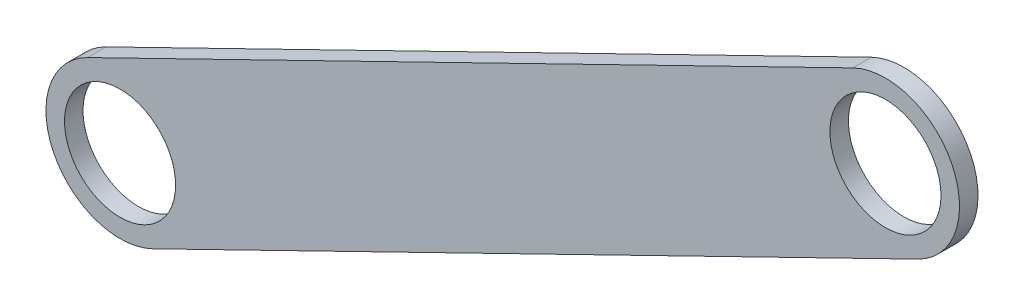
ISO-10303-21;
HEADER;
FILE_DESCRIPTION(('STEP AP214'),'2;1');
FILE_NAME('part.step','',(''),(''),'','','');
FILE_SCHEMA(('AUTOMOTIVE_DESIGN { 1 0 10303 214 1 1 1 1 }'));
ENDSEC;
DATA;
#1=APPLICATION_CONTEXT('core data for automotive mechanical design processes');
#2=APPLICATION_PROTOCOL_DEFINITION('international standard','automotive_design',2000,#1);
#3=PRODUCT_CONTEXT('',#1,'mechanical');
#4=PRODUCT('Part','Part','',(#3));
#5=PRODUCT_RELATED_PRODUCT_CATEGORY('part','',(#4));
#6=PRODUCT_DEFINITION_FORMATION('','',#4);
#7=PRODUCT_DEFINITION_CONTEXT('part definition',#1,'design');
#8=PRODUCT_DEFINITION('design','',#6,#7);
#9=PRODUCT_DEFINITION_SHAPE('','',#8);
#10=(LENGTH_UNIT() NAMED_UNIT(*) SI_UNIT(.MILLI.,.METRE.));
#11=(NAMED_UNIT(*) PLANE_ANGLE_UNIT() SI_UNIT($,.RADIAN.));
#12=(NAMED_UNIT(*) SI_UNIT($,.STERADIAN.) SOLID_ANGLE_UNIT());
#13=UNCERTAINTY_MEASURE_WITH_UNIT(LENGTH_MEASURE(1.E-05),#10,'distance_accuracy_value','');
#14=(GEOMETRIC_REPRESENTATION_CONTEXT(3) GLOBAL_UNCERTAINTY_ASSIGNED_CONTEXT((#13)) GLOBAL_UNIT_ASSIGNED_CONTEXT((#10,
#11,#12)) REPRESENTATION_CONTEXT('',''));
#15=CARTESIAN_POINT('',(0.,0.,0.));
#16=DIRECTION('',(0.,0.,1.));
#17=DIRECTION('',(1.,0.,0.));
#18=AXIS2_PLACEMENT_3D('',#15,#16,#17);
#19=CARTESIAN_POINT('',(0.,-12.,1.));
#20=DIRECTION('',(0.,0.,1.));
#21=DIRECTION('',(1.,0.,0.));
#22=AXIS2_PLACEMENT_3D('',#19,#20,#21);
#23=PLANE('',#22);
#24=CARTESIAN_POINT('',(0.,-12.,1.));
#25=DIRECTION('',(0.,0.,1.));
#26=DIRECTION('',(1.,0.,0.));
#27=AXIS2_PLACEMENT_3D('',#24,#25,#26);
#28=CIRCLE('',#27,3.);
#29=CARTESIAN_POINT('',(3.,-12.,1.));
#30=VERTEX_POINT('',#29);
#31=EDGE_CURVE('E108',#30,#30,#28,.T.);
#32=ORIENTED_EDGE('',*,*,#31,.F.);
#33=EDGE_LOOP('',(#32));
#34=FACE_BOUND('',#33,.T.);
#35=CARTESIAN_POINT('',(0.,-12.,1.));
#36=DIRECTION('',(0.,0.,1.));
#37=DIRECTION('',(1.,0.,0.));
#38=AXIS2_PLACEMENT_3D('',#35,#36,#37);
#39=CIRCLE('',#38,3.99999999999999);
#40=CARTESIAN_POINT('',(1.75511901397909,-15.5943785619727,1.));
#41=VERTEX_POINT('',#40);
#42=CARTESIAN_POINT('',(-1.75511901397908,-8.40562143802729,1.));
#43=VERTEX_POINT('',#42);
#44=EDGE_CURVE('E93',#41,#43,#39,.T.);
#45=ORIENTED_EDGE('',*,*,#44,.T.);
#46=DIRECTION('',(-0.89859464049318,-0.438779753494772,0.));
#47=VECTOR('',#46,1.);
#48=CARTESIAN_POINT('',(-1.75511901397908,-8.40562143802729,1.));
#49=LINE('',#48,#47);
#50=CARTESIAN_POINT('',(-43.0904724766654,-28.5894900987868,1.));
#51=VERTEX_POINT('',#50);
#52=EDGE_CURVE('E88',#43,#51,#49,.T.);
#53=ORIENTED_EDGE('',*,*,#52,.T.);
#54=CARTESIAN_POINT('',(-41.3353534626863,-32.1838686607595,1.));
#55=DIRECTION('',(0.,0.,1.));
#56=DIRECTION('',(1.,0.,0.));
#57=AXIS2_PLACEMENT_3D('',#54,#55,#56);
#58=CIRCLE('',#57,4.);
#59=CARTESIAN_POINT('',(-39.5802344487072,-35.7782472227322,1.));
#60=VERTEX_POINT('',#59);
#61=EDGE_CURVE('E91',#51,#60,#58,.T.);
#62=ORIENTED_EDGE('',*,*,#61,.T.);
#63=DIRECTION('',(0.89859464049318,0.438779753494772,0.));
#64=VECTOR('',#63,1.);
#65=CARTESIAN_POINT('',(1.75511901397909,-15.5943785619727,1.));
#66=LINE('',#65,#64);
#67=EDGE_CURVE('E58',#60,#41,#66,.T.);
#68=ORIENTED_EDGE('',*,*,#67,.T.);
#69=EDGE_LOOP('',(#45,#53,#62,#68));
#70=FACE_BOUND('',#69,.T.);
#71=CARTESIAN_POINT('',(-41.3353534626863,-32.1838686607595,1.));
#72=DIRECTION('',(0.,0.,1.));
#73=DIRECTION('',(1.,0.,0.));
#74=AXIS2_PLACEMENT_3D('',#71,#72,#73);
#75=CIRCLE('',#74,3.);
#76=CARTESIAN_POINT('',(-38.3353534626863,-32.1838686607595,1.));
#77=VERTEX_POINT('',#76);
#78=EDGE_CURVE('E123',#77,#77,#75,.T.);
#79=ORIENTED_EDGE('',*,*,#78,.F.);
#80=EDGE_LOOP('',(#79));
#81=FACE_BOUND('',#80,.T.);
#82=ADVANCED_FACE('F41',(#34,#70,#81),#23,.T.);
#83=CARTESIAN_POINT('',(0.,-12.,0.));
#84=DIRECTION('',(0.,0.,1.));
#85=DIRECTION('',(1.,0.,0.));
#86=AXIS2_PLACEMENT_3D('',#83,#84,#85);
#87=PLANE('',#86);
#88=CARTESIAN_POINT('',(0.,-12.,0.));
#89=DIRECTION('',(0.,0.,1.));
#90=DIRECTION('',(1.,0.,0.));
#91=AXIS2_PLACEMENT_3D('',#88,#89,#90);
#92=CIRCLE('',#91,3.99999999999999);
#93=CARTESIAN_POINT('',(1.75511901397909,-15.5943785619727,0.));
#94=VERTEX_POINT('',#93);
#95=CARTESIAN_POINT('',(-1.75511901397908,-8.40562143802729,0.));
#96=VERTEX_POINT('',#95);
#97=EDGE_CURVE('E105',#94,#96,#92,.T.);
#98=ORIENTED_EDGE('',*,*,#97,.F.);
#99=DIRECTION('',(0.89859464049318,0.438779753494772,0.));
#100=VECTOR('',#99,1.);
#101=CARTESIAN_POINT('',(1.75511901397909,-15.5943785619727,0.));
#102=LINE('',#101,#100);
#103=CARTESIAN_POINT('',(-39.5802344487072,-35.7782472227322,0.));
#104=VERTEX_POINT('',#103);
#105=EDGE_CURVE('E81',#104,#94,#102,.T.);
#106=ORIENTED_EDGE('',*,*,#105,.F.);
#107=CARTESIAN_POINT('',(-41.3353534626863,-32.1838686607595,0.));
#108=DIRECTION('',(0.,0.,1.));
#109=DIRECTION('',(1.,0.,0.));
#110=AXIS2_PLACEMENT_3D('',#107,#108,#109);
#111=CIRCLE('',#110,4.);
#112=CARTESIAN_POINT('',(-43.0904724766654,-28.5894900987868,0.));
#113=VERTEX_POINT('',#112);
#114=EDGE_CURVE('E75',#113,#104,#111,.T.);
#115=ORIENTED_EDGE('',*,*,#114,.F.);
#116=DIRECTION('',(-0.89859464049318,-0.438779753494772,0.));
#117=VECTOR('',#116,1.);
#118=CARTESIAN_POINT('',(-1.75511901397908,-8.40562143802729,0.));
#119=LINE('',#118,#117);
#120=EDGE_CURVE('E97',#96,#113,#119,.T.);
#121=ORIENTED_EDGE('',*,*,#120,.F.);
#122=EDGE_LOOP('',(#98,#106,#115,#121));
#123=FACE_BOUND('',#122,.T.);
#124=CARTESIAN_POINT('',(0.,-12.,0.));
#125=DIRECTION('',(0.,0.,1.));
#126=DIRECTION('',(1.,0.,0.));
#127=AXIS2_PLACEMENT_3D('',#124,#125,#126);
#128=CIRCLE('',#127,3.);
#129=CARTESIAN_POINT('',(3.,-12.,0.));
#130=VERTEX_POINT('',#129);
#131=EDGE_CURVE('E120',#130,#130,#128,.T.);
#132=ORIENTED_EDGE('',*,*,#131,.T.);
#133=EDGE_LOOP('',(#132));
#134=FACE_BOUND('',#133,.T.);
#135=CARTESIAN_POINT('',(-41.3353534626863,-32.1838686607595,0.));
#136=DIRECTION('',(0.,0.,1.));
#137=DIRECTION('',(1.,0.,0.));
#138=AXIS2_PLACEMENT_3D('',#135,#136,#137);
#139=CIRCLE('',#138,3.);
#140=CARTESIAN_POINT('',(-38.3353534626863,-32.1838686607595,0.));
#141=VERTEX_POINT('',#140);
#142=EDGE_CURVE('E126',#141,#141,#139,.T.);
#143=ORIENTED_EDGE('',*,*,#142,.T.);
#144=EDGE_LOOP('',(#143));
#145=FACE_BOUND('',#144,.T.);
#146=ADVANCED_FACE('F116',(#123,#134,#145),#87,.F.);
#147=CARTESIAN_POINT('',(0.,-12.,1.));
#148=DIRECTION('',(0.,0.,-1.));
#149=DIRECTION('',(-1.,0.,0.));
#150=AXIS2_PLACEMENT_3D('',#147,#148,#149);
#151=CYLINDRICAL_SURFACE('',#150,3.99999999999999);
#152=ORIENTED_EDGE('',*,*,#97,.T.);
#153=DIRECTION('',(0.,0.,-1.));
#154=VECTOR('',#153,1.);
#155=CARTESIAN_POINT('',(-1.75511901397908,-8.40562143802729,1.));
#156=LINE('',#155,#154);
#157=EDGE_CURVE('E11',#43,#96,#156,.T.);
#158=ORIENTED_EDGE('',*,*,#157,.F.);
#159=ORIENTED_EDGE('',*,*,#44,.F.);
#160=DIRECTION('',(0.,0.,-1.));
#161=VECTOR('',#160,1.);
#162=CARTESIAN_POINT('',(1.75511901397909,-15.5943785619727,1.));
#163=LINE('',#162,#161);
#164=EDGE_CURVE('E101',#41,#94,#163,.T.);
#165=ORIENTED_EDGE('',*,*,#164,.T.);
#166=EDGE_LOOP('',(#152,#158,#159,#165));
#167=FACE_BOUND('',#166,.T.);
#168=ADVANCED_FACE('F43',(#167),#151,.T.);
#169=CARTESIAN_POINT('',(-1.75511901397908,-8.40562143802729,1.));
#170=DIRECTION('',(0.438779753494772,-0.89859464049318,0.));
#171=DIRECTION('',(0.89859464049318,0.438779753494772,0.));
#172=AXIS2_PLACEMENT_3D('',#169,#170,#171);
#173=PLANE('',#172);
#174=ORIENTED_EDGE('',*,*,#120,.T.);
#175=DIRECTION('',(0.,0.,-1.));
#176=VECTOR('',#175,1.);
#177=CARTESIAN_POINT('',(-43.0904724766654,-28.5894900987868,1.));
#178=LINE('',#177,#176);
#179=EDGE_CURVE('E50',#51,#113,#178,.T.);
#180=ORIENTED_EDGE('',*,*,#179,.F.);
#181=ORIENTED_EDGE('',*,*,#52,.F.);
#182=ORIENTED_EDGE('',*,*,#157,.T.);
#183=EDGE_LOOP('',(#174,#180,#181,#182));
#184=FACE_BOUND('',#183,.T.);
#185=ADVANCED_FACE('F96',(#184),#173,.F.);
#186=CARTESIAN_POINT('',(-41.3353534626863,-32.1838686607595,1.));
#187=DIRECTION('',(0.,0.,-1.));
#188=DIRECTION('',(-1.,0.,0.));
#189=AXIS2_PLACEMENT_3D('',#186,#187,#188);
#190=CYLINDRICAL_SURFACE('',#189,4.);
#191=ORIENTED_EDGE('',*,*,#114,.T.);
#192=DIRECTION('',(0.,0.,-1.));
#193=VECTOR('',#192,1.);
#194=CARTESIAN_POINT('',(-39.5802344487072,-35.7782472227322,1.));
#195=LINE('',#194,#193);
#196=EDGE_CURVE('E98',#60,#104,#195,.T.);
#197=ORIENTED_EDGE('',*,*,#196,.F.);
#198=ORIENTED_EDGE('',*,*,#61,.F.);
#199=ORIENTED_EDGE('',*,*,#179,.T.);
#200=EDGE_LOOP('',(#191,#197,#198,#199));
#201=FACE_BOUND('',#200,.T.);
#202=ADVANCED_FACE('F99',(#201),#190,.T.);
#203=CARTESIAN_POINT('',(1.75511901397909,-15.5943785619727,1.));
#204=DIRECTION('',(-0.438779753494772,0.89859464049318,0.));
#205=DIRECTION('',(-0.89859464049318,-0.438779753494772,0.));
#206=AXIS2_PLACEMENT_3D('',#203,#204,#205);
#207=PLANE('',#206);
#208=ORIENTED_EDGE('',*,*,#105,.T.);
#209=ORIENTED_EDGE('',*,*,#164,.F.);
#210=ORIENTED_EDGE('',*,*,#67,.F.);
#211=ORIENTED_EDGE('',*,*,#196,.T.);
#212=EDGE_LOOP('',(#208,#209,#210,#211));
#213=FACE_BOUND('',#212,.T.);
#214=ADVANCED_FACE('F113',(#213),#207,.F.);
#215=CARTESIAN_POINT('',(0.,-12.,1.));
#216=DIRECTION('',(0.,0.,-1.));
#217=DIRECTION('',(-1.,0.,0.));
#218=AXIS2_PLACEMENT_3D('',#215,#216,#217);
#219=CYLINDRICAL_SURFACE('',#218,3.);
#220=ORIENTED_EDGE('',*,*,#31,.T.);
#221=EDGE_LOOP('',(#220));
#222=FACE_BOUND('',#221,.T.);
#223=ORIENTED_EDGE('',*,*,#131,.F.);
#224=EDGE_LOOP('',(#223));
#225=FACE_BOUND('',#224,.T.);
#226=ADVANCED_FACE('F143',(#222,#225),#219,.F.);
#227=CARTESIAN_POINT('',(-41.3353534626863,-32.1838686607595,1.));
#228=DIRECTION('',(0.,0.,-1.));
#229=DIRECTION('',(-1.,0.,0.));
#230=AXIS2_PLACEMENT_3D('',#227,#228,#229);
#231=CYLINDRICAL_SURFACE('',#230,3.);
#232=ORIENTED_EDGE('',*,*,#78,.T.);
#233=EDGE_LOOP('',(#232));
#234=FACE_BOUND('',#233,.T.);
#235=ORIENTED_EDGE('',*,*,#142,.F.);
#236=EDGE_LOOP('',(#235));
#237=FACE_BOUND('',#236,.T.);
#238=ADVANCED_FACE('F132',(#234,#237),#231,.F.);
#239=CLOSED_SHELL('',(#82,#146,#168,#185,#202,#214,#226,#238));
#240=MANIFOLD_SOLID_BREP('B2',#239);
#241=ADVANCED_BREP_SHAPE_REPRESENTATION('',(#18,#240),#14);
#242=SHAPE_DEFINITION_REPRESENTATION(#9,#241);
ENDSEC;
END-ISO-10303-21;
